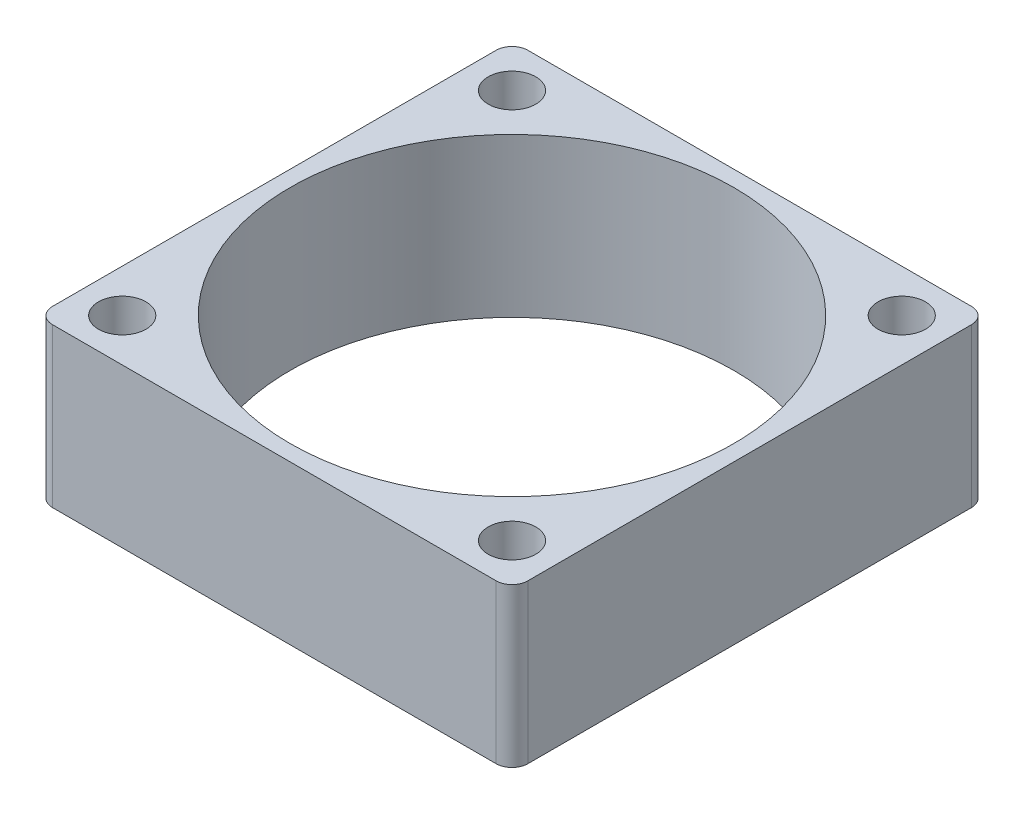
ISO-10303-21;
HEADER;
FILE_DESCRIPTION(('STEP AP214'),'2;1');
FILE_NAME('part.step','',(''),(''),'','','');
FILE_SCHEMA(('AUTOMOTIVE_DESIGN { 1 0 10303 214 1 1 1 1 }'));
ENDSEC;
DATA;
#1=APPLICATION_CONTEXT('core data for automotive mechanical design processes');
#2=APPLICATION_PROTOCOL_DEFINITION('international standard','automotive_design',2000,#1);
#3=PRODUCT_CONTEXT('',#1,'mechanical');
#4=PRODUCT('Part','Part','',(#3));
#5=PRODUCT_RELATED_PRODUCT_CATEGORY('part','',(#4));
#6=PRODUCT_DEFINITION_FORMATION('','',#4);
#7=PRODUCT_DEFINITION_CONTEXT('part definition',#1,'design');
#8=PRODUCT_DEFINITION('design','',#6,#7);
#9=PRODUCT_DEFINITION_SHAPE('','',#8);
#10=(LENGTH_UNIT() NAMED_UNIT(*) SI_UNIT(.MILLI.,.METRE.));
#11=(NAMED_UNIT(*) PLANE_ANGLE_UNIT() SI_UNIT($,.RADIAN.));
#12=(NAMED_UNIT(*) SI_UNIT($,.STERADIAN.) SOLID_ANGLE_UNIT());
#13=UNCERTAINTY_MEASURE_WITH_UNIT(LENGTH_MEASURE(1.E-05),#10,'distance_accuracy_value','');
#14=(GEOMETRIC_REPRESENTATION_CONTEXT(3) GLOBAL_UNCERTAINTY_ASSIGNED_CONTEXT((#13)) GLOBAL_UNIT_ASSIGNED_CONTEXT((#10,
#11,#12)) REPRESENTATION_CONTEXT('',''));
#15=CARTESIAN_POINT('',(0.,0.,0.));
#16=DIRECTION('',(0.,0.,1.));
#17=DIRECTION('',(1.,0.,0.));
#18=AXIS2_PLACEMENT_3D('',#15,#16,#17);
#19=CARTESIAN_POINT('',(15.,10.,-15.));
#20=DIRECTION('',(-1.,0.,0.));
#21=DIRECTION('',(0.,0.,1.));
#22=AXIS2_PLACEMENT_3D('',#19,#20,#21);
#23=PLANE('',#22);
#24=DIRECTION('',(0.,0.,-1.));
#25=VECTOR('',#24,1.);
#26=CARTESIAN_POINT('',(15.,10.,-15.));
#27=LINE('',#26,#25);
#28=CARTESIAN_POINT('',(15.,10.,14.));
#29=VERTEX_POINT('',#28);
#30=CARTESIAN_POINT('',(15.,10.,-14.));
#31=VERTEX_POINT('',#30);
#32=EDGE_CURVE('E133',#29,#31,#27,.T.);
#33=ORIENTED_EDGE('',*,*,#32,.F.);
#34=DIRECTION('',(0.,-1.,0.));
#35=VECTOR('',#34,1.);
#36=CARTESIAN_POINT('',(15.,10.,14.));
#37=LINE('',#36,#35);
#38=CARTESIAN_POINT('',(15.,0.,14.));
#39=VERTEX_POINT('',#38);
#40=EDGE_CURVE('E11',#29,#39,#37,.T.);
#41=ORIENTED_EDGE('',*,*,#40,.T.);
#42=DIRECTION('',(0.,0.,-1.));
#43=VECTOR('',#42,1.);
#44=CARTESIAN_POINT('',(15.,0.,-15.));
#45=LINE('',#44,#43);
#46=CARTESIAN_POINT('',(15.,0.,-14.));
#47=VERTEX_POINT('',#46);
#48=EDGE_CURVE('E135',#39,#47,#45,.T.);
#49=ORIENTED_EDGE('',*,*,#48,.T.);
#50=DIRECTION('',(0.,-1.,0.));
#51=VECTOR('',#50,1.);
#52=CARTESIAN_POINT('',(15.,10.,-14.));
#53=LINE('',#52,#51);
#54=EDGE_CURVE('E46',#47,#31,#53,.F.);
#55=ORIENTED_EDGE('',*,*,#54,.T.);
#56=EDGE_LOOP('',(#33,#41,#49,#55));
#57=FACE_BOUND('',#56,.T.);
#58=ADVANCED_FACE('F38',(#57),#23,.F.);
#59=CARTESIAN_POINT('',(-15.,10.,-15.));
#60=DIRECTION('',(0.,0.,1.));
#61=DIRECTION('',(1.,0.,0.));
#62=AXIS2_PLACEMENT_3D('',#59,#60,#61);
#63=PLANE('',#62);
#64=DIRECTION('',(-1.,0.,0.));
#65=VECTOR('',#64,1.);
#66=CARTESIAN_POINT('',(-15.,0.,-15.));
#67=LINE('',#66,#65);
#68=CARTESIAN_POINT('',(14.,0.,-15.));
#69=VERTEX_POINT('',#68);
#70=CARTESIAN_POINT('',(-14.,0.,-15.));
#71=VERTEX_POINT('',#70);
#72=EDGE_CURVE('E131',#69,#71,#67,.T.);
#73=ORIENTED_EDGE('',*,*,#72,.T.);
#74=DIRECTION('',(0.,-1.,0.));
#75=VECTOR('',#74,1.);
#76=CARTESIAN_POINT('',(-14.,10.,-15.));
#77=LINE('',#76,#75);
#78=CARTESIAN_POINT('',(-14.,10.,-15.));
#79=VERTEX_POINT('',#78);
#80=EDGE_CURVE('E110',#71,#79,#77,.F.);
#81=ORIENTED_EDGE('',*,*,#80,.T.);
#82=DIRECTION('',(-1.,0.,0.));
#83=VECTOR('',#82,1.);
#84=CARTESIAN_POINT('',(-15.,10.,-15.));
#85=LINE('',#84,#83);
#86=CARTESIAN_POINT('',(14.,10.,-15.));
#87=VERTEX_POINT('',#86);
#88=EDGE_CURVE('E171',#87,#79,#85,.T.);
#89=ORIENTED_EDGE('',*,*,#88,.F.);
#90=DIRECTION('',(0.,-1.,0.));
#91=VECTOR('',#90,1.);
#92=CARTESIAN_POINT('',(14.,10.,-15.));
#93=LINE('',#92,#91);
#94=EDGE_CURVE('E115',#87,#69,#93,.T.);
#95=ORIENTED_EDGE('',*,*,#94,.T.);
#96=EDGE_LOOP('',(#73,#81,#89,#95));
#97=FACE_BOUND('',#96,.T.);
#98=ADVANCED_FACE('F175',(#97),#63,.F.);
#99=CARTESIAN_POINT('',(-15.,10.,-15.));
#100=DIRECTION('',(1.,0.,0.));
#101=DIRECTION('',(0.,0.,-1.));
#102=AXIS2_PLACEMENT_3D('',#99,#100,#101);
#103=PLANE('',#102);
#104=DIRECTION('',(0.,0.,1.));
#105=VECTOR('',#104,1.);
#106=CARTESIAN_POINT('',(-15.,10.,-15.));
#107=LINE('',#106,#105);
#108=CARTESIAN_POINT('',(-15.,10.,-14.));
#109=VERTEX_POINT('',#108);
#110=CARTESIAN_POINT('',(-15.,10.,14.));
#111=VERTEX_POINT('',#110);
#112=EDGE_CURVE('E124',#109,#111,#107,.T.);
#113=ORIENTED_EDGE('',*,*,#112,.F.);
#114=DIRECTION('',(0.,-1.,0.));
#115=VECTOR('',#114,1.);
#116=CARTESIAN_POINT('',(-15.,10.,-14.));
#117=LINE('',#116,#115);
#118=CARTESIAN_POINT('',(-15.,0.,-14.));
#119=VERTEX_POINT('',#118);
#120=EDGE_CURVE('E109',#109,#119,#117,.T.);
#121=ORIENTED_EDGE('',*,*,#120,.T.);
#122=DIRECTION('',(0.,0.,1.));
#123=VECTOR('',#122,1.);
#124=CARTESIAN_POINT('',(-15.,0.,-15.));
#125=LINE('',#124,#123);
#126=CARTESIAN_POINT('',(-15.,0.,14.));
#127=VERTEX_POINT('',#126);
#128=EDGE_CURVE('E122',#119,#127,#125,.T.);
#129=ORIENTED_EDGE('',*,*,#128,.T.);
#130=DIRECTION('',(0.,-1.,0.));
#131=VECTOR('',#130,1.);
#132=CARTESIAN_POINT('',(-15.,10.,14.));
#133=LINE('',#132,#131);
#134=EDGE_CURVE('E126',#127,#111,#133,.F.);
#135=ORIENTED_EDGE('',*,*,#134,.T.);
#136=EDGE_LOOP('',(#113,#121,#129,#135));
#137=FACE_BOUND('',#136,.T.);
#138=ADVANCED_FACE('F121',(#137),#103,.F.);
#139=CARTESIAN_POINT('',(-15.,10.,15.));
#140=DIRECTION('',(0.,0.,-1.));
#141=DIRECTION('',(-1.,0.,0.));
#142=AXIS2_PLACEMENT_3D('',#139,#140,#141);
#143=PLANE('',#142);
#144=DIRECTION('',(1.,0.,0.));
#145=VECTOR('',#144,1.);
#146=CARTESIAN_POINT('',(-15.,10.,15.));
#147=LINE('',#146,#145);
#148=CARTESIAN_POINT('',(-14.,10.,15.));
#149=VERTEX_POINT('',#148);
#150=CARTESIAN_POINT('',(14.,10.,15.));
#151=VERTEX_POINT('',#150);
#152=EDGE_CURVE('E139',#149,#151,#147,.T.);
#153=ORIENTED_EDGE('',*,*,#152,.F.);
#154=DIRECTION('',(0.,-1.,0.));
#155=VECTOR('',#154,1.);
#156=CARTESIAN_POINT('',(-14.,10.,15.));
#157=LINE('',#156,#155);
#158=CARTESIAN_POINT('',(-14.,0.,15.));
#159=VERTEX_POINT('',#158);
#160=EDGE_CURVE('E156',#149,#159,#157,.T.);
#161=ORIENTED_EDGE('',*,*,#160,.T.);
#162=DIRECTION('',(1.,0.,0.));
#163=VECTOR('',#162,1.);
#164=CARTESIAN_POINT('',(-15.,0.,15.));
#165=LINE('',#164,#163);
#166=CARTESIAN_POINT('',(14.,0.,15.));
#167=VERTEX_POINT('',#166);
#168=EDGE_CURVE('E130',#159,#167,#165,.T.);
#169=ORIENTED_EDGE('',*,*,#168,.T.);
#170=DIRECTION('',(0.,-1.,0.));
#171=VECTOR('',#170,1.);
#172=CARTESIAN_POINT('',(14.,10.,15.));
#173=LINE('',#172,#171);
#174=EDGE_CURVE('E53',#167,#151,#173,.F.);
#175=ORIENTED_EDGE('',*,*,#174,.T.);
#176=EDGE_LOOP('',(#153,#161,#169,#175));
#177=FACE_BOUND('',#176,.T.);
#178=ADVANCED_FACE('F221',(#177),#143,.F.);
#179=CARTESIAN_POINT('',(0.,10.,0.));
#180=DIRECTION('',(0.,1.,0.));
#181=DIRECTION('',(0.,0.,1.));
#182=AXIS2_PLACEMENT_3D('',#179,#180,#181);
#183=PLANE('',#182);
#184=CARTESIAN_POINT('',(0.,10.,0.));
#185=DIRECTION('',(0.,1.,0.));
#186=DIRECTION('',(0.,0.,1.));
#187=AXIS2_PLACEMENT_3D('',#184,#185,#186);
#188=CIRCLE('',#187,14.);
#189=CARTESIAN_POINT('',(0.,10.,14.));
#190=VERTEX_POINT('',#189);
#191=EDGE_CURVE('E205',#190,#190,#188,.T.);
#192=ORIENTED_EDGE('',*,*,#191,.F.);
#193=EDGE_LOOP('',(#192));
#194=FACE_BOUND('',#193,.T.);
#195=CARTESIAN_POINT('',(12.3,10.,-12.3));
#196=DIRECTION('',(0.,1.,0.));
#197=DIRECTION('',(0.,0.,1.));
#198=AXIS2_PLACEMENT_3D('',#195,#196,#197);
#199=CIRCLE('',#198,1.5);
#200=CARTESIAN_POINT('',(12.3,10.,-10.8));
#201=VERTEX_POINT('',#200);
#202=EDGE_CURVE('E185',#201,#201,#199,.T.);
#203=ORIENTED_EDGE('',*,*,#202,.F.);
#204=EDGE_LOOP('',(#203));
#205=FACE_BOUND('',#204,.T.);
#206=CARTESIAN_POINT('',(-12.3,10.,12.3));
#207=DIRECTION('',(0.,1.,0.));
#208=DIRECTION('',(0.,0.,1.));
#209=AXIS2_PLACEMENT_3D('',#206,#207,#208);
#210=CIRCLE('',#209,1.5);
#211=CARTESIAN_POINT('',(-12.3,10.,13.8));
#212=VERTEX_POINT('',#211);
#213=EDGE_CURVE('E190',#212,#212,#210,.T.);
#214=ORIENTED_EDGE('',*,*,#213,.F.);
#215=EDGE_LOOP('',(#214));
#216=FACE_BOUND('',#215,.T.);
#217=CARTESIAN_POINT('',(12.3,10.,12.3));
#218=DIRECTION('',(0.,1.,0.));
#219=DIRECTION('',(0.,0.,1.));
#220=AXIS2_PLACEMENT_3D('',#217,#218,#219);
#221=CIRCLE('',#220,1.5);
#222=CARTESIAN_POINT('',(12.3,10.,13.8));
#223=VERTEX_POINT('',#222);
#224=EDGE_CURVE('E191',#223,#223,#221,.T.);
#225=ORIENTED_EDGE('',*,*,#224,.F.);
#226=EDGE_LOOP('',(#225));
#227=FACE_BOUND('',#226,.T.);
#228=CARTESIAN_POINT('',(-12.3,10.,-12.3));
#229=DIRECTION('',(0.,1.,0.));
#230=DIRECTION('',(0.,0.,1.));
#231=AXIS2_PLACEMENT_3D('',#228,#229,#230);
#232=CIRCLE('',#231,1.5);
#233=CARTESIAN_POINT('',(-12.3,10.,-10.8));
#234=VERTEX_POINT('',#233);
#235=EDGE_CURVE('E178',#234,#234,#232,.T.);
#236=ORIENTED_EDGE('',*,*,#235,.F.);
#237=EDGE_LOOP('',(#236));
#238=FACE_BOUND('',#237,.T.);
#239=ORIENTED_EDGE('',*,*,#88,.T.);
#240=CARTESIAN_POINT('',(-14.,10.,-14.));
#241=DIRECTION('',(0.,1.,0.));
#242=DIRECTION('',(0.,0.,1.));
#243=AXIS2_PLACEMENT_3D('',#240,#241,#242);
#244=CIRCLE('',#243,1.);
#245=EDGE_CURVE('E153',#79,#109,#244,.T.);
#246=ORIENTED_EDGE('',*,*,#245,.T.);
#247=ORIENTED_EDGE('',*,*,#112,.T.);
#248=CARTESIAN_POINT('',(-14.,10.,14.));
#249=DIRECTION('',(0.,1.,0.));
#250=DIRECTION('',(0.,0.,1.));
#251=AXIS2_PLACEMENT_3D('',#248,#249,#250);
#252=CIRCLE('',#251,1.);
#253=EDGE_CURVE('E60',#111,#149,#252,.T.);
#254=ORIENTED_EDGE('',*,*,#253,.T.);
#255=ORIENTED_EDGE('',*,*,#152,.T.);
#256=CARTESIAN_POINT('',(14.,10.,14.));
#257=DIRECTION('',(0.,1.,0.));
#258=DIRECTION('',(0.,0.,1.));
#259=AXIS2_PLACEMENT_3D('',#256,#257,#258);
#260=CIRCLE('',#259,1.);
#261=EDGE_CURVE('E150',#151,#29,#260,.T.);
#262=ORIENTED_EDGE('',*,*,#261,.T.);
#263=ORIENTED_EDGE('',*,*,#32,.T.);
#264=CARTESIAN_POINT('',(14.,10.,-14.));
#265=DIRECTION('',(0.,1.,0.));
#266=DIRECTION('',(0.,0.,1.));
#267=AXIS2_PLACEMENT_3D('',#264,#265,#266);
#268=CIRCLE('',#267,1.);
#269=EDGE_CURVE('E148',#31,#87,#268,.T.);
#270=ORIENTED_EDGE('',*,*,#269,.T.);
#271=EDGE_LOOP('',(#239,#246,#247,#254,#255,#262,#263,#270));
#272=FACE_BOUND('',#271,.T.);
#273=ADVANCED_FACE('F168',(#194,#205,#216,#227,#238,#272),#183,.T.);
#274=CARTESIAN_POINT('',(0.,0.,0.));
#275=DIRECTION('',(0.,1.,0.));
#276=DIRECTION('',(0.,0.,1.));
#277=AXIS2_PLACEMENT_3D('',#274,#275,#276);
#278=PLANE('',#277);
#279=CARTESIAN_POINT('',(0.,0.,0.));
#280=DIRECTION('',(0.,1.,0.));
#281=DIRECTION('',(0.,0.,1.));
#282=AXIS2_PLACEMENT_3D('',#279,#280,#281);
#283=CIRCLE('',#282,14.);
#284=CARTESIAN_POINT('',(0.,0.,14.));
#285=VERTEX_POINT('',#284);
#286=EDGE_CURVE('E202',#285,#285,#283,.T.);
#287=ORIENTED_EDGE('',*,*,#286,.T.);
#288=EDGE_LOOP('',(#287));
#289=FACE_BOUND('',#288,.T.);
#290=CARTESIAN_POINT('',(12.3,0.,-12.3));
#291=DIRECTION('',(0.,1.,0.));
#292=DIRECTION('',(0.,0.,1.));
#293=AXIS2_PLACEMENT_3D('',#290,#291,#292);
#294=CIRCLE('',#293,1.5);
#295=CARTESIAN_POINT('',(12.3,0.,-10.8));
#296=VERTEX_POINT('',#295);
#297=EDGE_CURVE('E194',#296,#296,#294,.T.);
#298=ORIENTED_EDGE('',*,*,#297,.T.);
#299=EDGE_LOOP('',(#298));
#300=FACE_BOUND('',#299,.T.);
#301=CARTESIAN_POINT('',(-12.3,0.,12.3));
#302=DIRECTION('',(0.,1.,0.));
#303=DIRECTION('',(0.,0.,1.));
#304=AXIS2_PLACEMENT_3D('',#301,#302,#303);
#305=CIRCLE('',#304,1.5);
#306=CARTESIAN_POINT('',(-12.3,0.,13.8));
#307=VERTEX_POINT('',#306);
#308=EDGE_CURVE('E187',#307,#307,#305,.T.);
#309=ORIENTED_EDGE('',*,*,#308,.T.);
#310=EDGE_LOOP('',(#309));
#311=FACE_BOUND('',#310,.T.);
#312=CARTESIAN_POINT('',(12.3,0.,12.3));
#313=DIRECTION('',(0.,1.,0.));
#314=DIRECTION('',(0.,0.,1.));
#315=AXIS2_PLACEMENT_3D('',#312,#313,#314);
#316=CIRCLE('',#315,1.5);
#317=CARTESIAN_POINT('',(12.3,0.,13.8));
#318=VERTEX_POINT('',#317);
#319=EDGE_CURVE('E199',#318,#318,#316,.T.);
#320=ORIENTED_EDGE('',*,*,#319,.T.);
#321=EDGE_LOOP('',(#320));
#322=FACE_BOUND('',#321,.T.);
#323=CARTESIAN_POINT('',(-12.3,0.,-12.3));
#324=DIRECTION('',(0.,1.,0.));
#325=DIRECTION('',(0.,0.,1.));
#326=AXIS2_PLACEMENT_3D('',#323,#324,#325);
#327=CIRCLE('',#326,1.5);
#328=CARTESIAN_POINT('',(-12.3,0.,-10.8));
#329=VERTEX_POINT('',#328);
#330=EDGE_CURVE('E176',#329,#329,#327,.T.);
#331=ORIENTED_EDGE('',*,*,#330,.T.);
#332=EDGE_LOOP('',(#331));
#333=FACE_BOUND('',#332,.T.);
#334=ORIENTED_EDGE('',*,*,#128,.F.);
#335=CARTESIAN_POINT('',(-14.,0.,-14.));
#336=DIRECTION('',(0.,1.,0.));
#337=DIRECTION('',(0.,0.,1.));
#338=AXIS2_PLACEMENT_3D('',#335,#336,#337);
#339=CIRCLE('',#338,1.);
#340=EDGE_CURVE('E105',#119,#71,#339,.F.);
#341=ORIENTED_EDGE('',*,*,#340,.T.);
#342=ORIENTED_EDGE('',*,*,#72,.F.);
#343=CARTESIAN_POINT('',(14.,0.,-14.));
#344=DIRECTION('',(0.,1.,0.));
#345=DIRECTION('',(0.,0.,1.));
#346=AXIS2_PLACEMENT_3D('',#343,#344,#345);
#347=CIRCLE('',#346,1.);
#348=EDGE_CURVE('E125',#69,#47,#347,.F.);
#349=ORIENTED_EDGE('',*,*,#348,.T.);
#350=ORIENTED_EDGE('',*,*,#48,.F.);
#351=CARTESIAN_POINT('',(14.,0.,14.));
#352=DIRECTION('',(0.,1.,0.));
#353=DIRECTION('',(0.,0.,1.));
#354=AXIS2_PLACEMENT_3D('',#351,#352,#353);
#355=CIRCLE('',#354,1.);
#356=EDGE_CURVE('E142',#39,#167,#355,.F.);
#357=ORIENTED_EDGE('',*,*,#356,.T.);
#358=ORIENTED_EDGE('',*,*,#168,.F.);
#359=CARTESIAN_POINT('',(-14.,0.,14.));
#360=DIRECTION('',(0.,1.,0.));
#361=DIRECTION('',(0.,0.,1.));
#362=AXIS2_PLACEMENT_3D('',#359,#360,#361);
#363=CIRCLE('',#362,1.);
#364=EDGE_CURVE('E116',#159,#127,#363,.F.);
#365=ORIENTED_EDGE('',*,*,#364,.T.);
#366=EDGE_LOOP('',(#334,#341,#342,#349,#350,#357,#358,#365));
#367=FACE_BOUND('',#366,.T.);
#368=ADVANCED_FACE('F128',(#289,#300,#311,#322,#333,#367),#278,.F.);
#369=CARTESIAN_POINT('',(-12.3,0.,-12.3));
#370=DIRECTION('',(0.,1.,0.));
#371=DIRECTION('',(0.,0.,1.));
#372=AXIS2_PLACEMENT_3D('',#369,#370,#371);
#373=CYLINDRICAL_SURFACE('',#372,1.5);
#374=ORIENTED_EDGE('',*,*,#330,.F.);
#375=EDGE_LOOP('',(#374));
#376=FACE_BOUND('',#375,.T.);
#377=ORIENTED_EDGE('',*,*,#235,.T.);
#378=EDGE_LOOP('',(#377));
#379=FACE_BOUND('',#378,.T.);
#380=ADVANCED_FACE('F231',(#376,#379),#373,.F.);
#381=CARTESIAN_POINT('',(12.3,0.,12.3));
#382=DIRECTION('',(0.,1.,0.));
#383=DIRECTION('',(0.,0.,1.));
#384=AXIS2_PLACEMENT_3D('',#381,#382,#383);
#385=CYLINDRICAL_SURFACE('',#384,1.5);
#386=ORIENTED_EDGE('',*,*,#319,.F.);
#387=EDGE_LOOP('',(#386));
#388=FACE_BOUND('',#387,.T.);
#389=ORIENTED_EDGE('',*,*,#224,.T.);
#390=EDGE_LOOP('',(#389));
#391=FACE_BOUND('',#390,.T.);
#392=ADVANCED_FACE('F233',(#388,#391),#385,.F.);
#393=CARTESIAN_POINT('',(-12.3,0.,12.3));
#394=DIRECTION('',(0.,1.,0.));
#395=DIRECTION('',(0.,0.,1.));
#396=AXIS2_PLACEMENT_3D('',#393,#394,#395);
#397=CYLINDRICAL_SURFACE('',#396,1.5);
#398=ORIENTED_EDGE('',*,*,#308,.F.);
#399=EDGE_LOOP('',(#398));
#400=FACE_BOUND('',#399,.T.);
#401=ORIENTED_EDGE('',*,*,#213,.T.);
#402=EDGE_LOOP('',(#401));
#403=FACE_BOUND('',#402,.T.);
#404=ADVANCED_FACE('F240',(#400,#403),#397,.F.);
#405=CARTESIAN_POINT('',(12.3,0.,-12.3));
#406=DIRECTION('',(0.,1.,0.));
#407=DIRECTION('',(0.,0.,1.));
#408=AXIS2_PLACEMENT_3D('',#405,#406,#407);
#409=CYLINDRICAL_SURFACE('',#408,1.5);
#410=ORIENTED_EDGE('',*,*,#297,.F.);
#411=EDGE_LOOP('',(#410));
#412=FACE_BOUND('',#411,.T.);
#413=ORIENTED_EDGE('',*,*,#202,.T.);
#414=EDGE_LOOP('',(#413));
#415=FACE_BOUND('',#414,.T.);
#416=ADVANCED_FACE('F258',(#412,#415),#409,.F.);
#417=CARTESIAN_POINT('',(-14.,10.,-14.));
#418=DIRECTION('',(0.,-1.,0.));
#419=DIRECTION('',(0.,0.,-1.));
#420=AXIS2_PLACEMENT_3D('',#417,#418,#419);
#421=CYLINDRICAL_SURFACE('',#420,1.);
#422=ORIENTED_EDGE('',*,*,#245,.F.);
#423=ORIENTED_EDGE('',*,*,#80,.F.);
#424=ORIENTED_EDGE('',*,*,#340,.F.);
#425=ORIENTED_EDGE('',*,*,#120,.F.);
#426=EDGE_LOOP('',(#422,#423,#424,#425));
#427=FACE_BOUND('',#426,.T.);
#428=ADVANCED_FACE('F108',(#427),#421,.T.);
#429=CARTESIAN_POINT('',(-14.,10.,14.));
#430=DIRECTION('',(0.,-1.,0.));
#431=DIRECTION('',(0.,0.,-1.));
#432=AXIS2_PLACEMENT_3D('',#429,#430,#431);
#433=CYLINDRICAL_SURFACE('',#432,1.);
#434=ORIENTED_EDGE('',*,*,#253,.F.);
#435=ORIENTED_EDGE('',*,*,#134,.F.);
#436=ORIENTED_EDGE('',*,*,#364,.F.);
#437=ORIENTED_EDGE('',*,*,#160,.F.);
#438=EDGE_LOOP('',(#434,#435,#436,#437));
#439=FACE_BOUND('',#438,.T.);
#440=ADVANCED_FACE('F257',(#439),#433,.T.);
#441=CARTESIAN_POINT('',(14.,10.,14.));
#442=DIRECTION('',(0.,-1.,0.));
#443=DIRECTION('',(0.,0.,-1.));
#444=AXIS2_PLACEMENT_3D('',#441,#442,#443);
#445=CYLINDRICAL_SURFACE('',#444,1.);
#446=ORIENTED_EDGE('',*,*,#261,.F.);
#447=ORIENTED_EDGE('',*,*,#174,.F.);
#448=ORIENTED_EDGE('',*,*,#356,.F.);
#449=ORIENTED_EDGE('',*,*,#40,.F.);
#450=EDGE_LOOP('',(#446,#447,#448,#449));
#451=FACE_BOUND('',#450,.T.);
#452=ADVANCED_FACE('F260',(#451),#445,.T.);
#453=CARTESIAN_POINT('',(14.,10.,-14.));
#454=DIRECTION('',(0.,-1.,0.));
#455=DIRECTION('',(0.,0.,-1.));
#456=AXIS2_PLACEMENT_3D('',#453,#454,#455);
#457=CYLINDRICAL_SURFACE('',#456,1.);
#458=ORIENTED_EDGE('',*,*,#269,.F.);
#459=ORIENTED_EDGE('',*,*,#54,.F.);
#460=ORIENTED_EDGE('',*,*,#348,.F.);
#461=ORIENTED_EDGE('',*,*,#94,.F.);
#462=EDGE_LOOP('',(#458,#459,#460,#461));
#463=FACE_BOUND('',#462,.T.);
#464=ADVANCED_FACE('F40',(#463),#457,.T.);
#465=CARTESIAN_POINT('',(0.,0.,0.));
#466=DIRECTION('',(0.,1.,0.));
#467=DIRECTION('',(0.,0.,1.));
#468=AXIS2_PLACEMENT_3D('',#465,#466,#467);
#469=CYLINDRICAL_SURFACE('',#468,14.);
#470=ORIENTED_EDGE('',*,*,#286,.F.);
#471=EDGE_LOOP('',(#470));
#472=FACE_BOUND('',#471,.T.);
#473=ORIENTED_EDGE('',*,*,#191,.T.);
#474=EDGE_LOOP('',(#473));
#475=FACE_BOUND('',#474,.T.);
#476=ADVANCED_FACE('F213',(#472,#475),#469,.F.);
#477=CLOSED_SHELL('',(#58,#98,#138,#178,#273,#368,#380,#392,#404,#416,#428,#440,#452,#464,#476));
#478=MANIFOLD_SOLID_BREP('B2',#477);
#479=ADVANCED_BREP_SHAPE_REPRESENTATION('',(#18,#478),#14);
#480=SHAPE_DEFINITION_REPRESENTATION(#9,#479);
ENDSEC;
END-ISO-10303-21;
